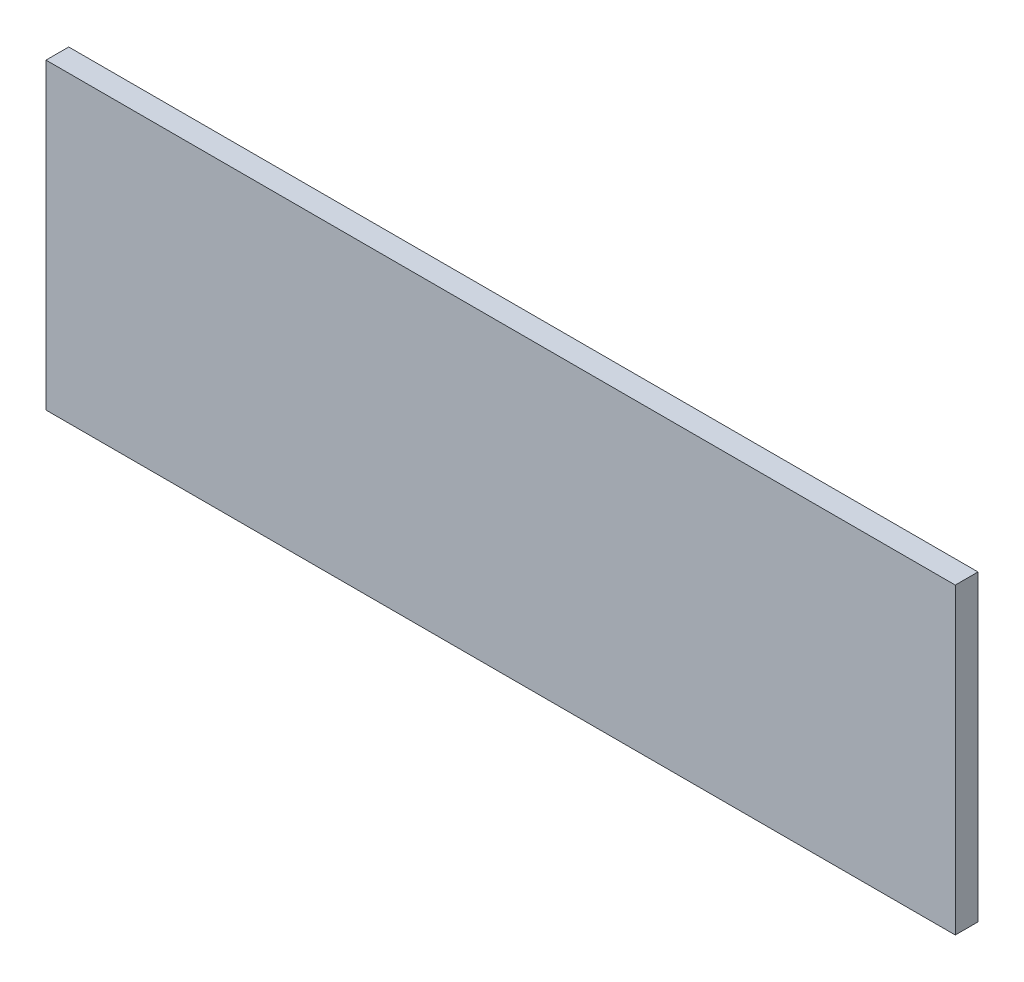
ISO-10303-21;
HEADER;
FILE_DESCRIPTION(('STEP AP214'),'2;1');
FILE_NAME('part.step','',(''),(''),'','','');
FILE_SCHEMA(('AUTOMOTIVE_DESIGN { 1 0 10303 214 1 1 1 1 }'));
ENDSEC;
DATA;
#1=APPLICATION_CONTEXT('core data for automotive mechanical design processes');
#2=APPLICATION_PROTOCOL_DEFINITION('international standard','automotive_design',2000,#1);
#3=PRODUCT_CONTEXT('',#1,'mechanical');
#4=PRODUCT('Part','Part','',(#3));
#5=PRODUCT_RELATED_PRODUCT_CATEGORY('part','',(#4));
#6=PRODUCT_DEFINITION_FORMATION('','',#4);
#7=PRODUCT_DEFINITION_CONTEXT('part definition',#1,'design');
#8=PRODUCT_DEFINITION('design','',#6,#7);
#9=PRODUCT_DEFINITION_SHAPE('','',#8);
#10=(LENGTH_UNIT() NAMED_UNIT(*) SI_UNIT(.MILLI.,.METRE.));
#11=(NAMED_UNIT(*) PLANE_ANGLE_UNIT() SI_UNIT($,.RADIAN.));
#12=(NAMED_UNIT(*) SI_UNIT($,.STERADIAN.) SOLID_ANGLE_UNIT());
#13=UNCERTAINTY_MEASURE_WITH_UNIT(LENGTH_MEASURE(1.E-05),#10,'distance_accuracy_value','');
#14=(GEOMETRIC_REPRESENTATION_CONTEXT(3) GLOBAL_UNCERTAINTY_ASSIGNED_CONTEXT((#13)) GLOBAL_UNIT_ASSIGNED_CONTEXT((#10,
#11,#12)) REPRESENTATION_CONTEXT('',''));
#15=CARTESIAN_POINT('',(0.,0.,0.));
#16=DIRECTION('',(0.,0.,1.));
#17=DIRECTION('',(1.,0.,0.));
#18=AXIS2_PLACEMENT_3D('',#15,#16,#17);
#19=CARTESIAN_POINT('',(6000.,2000.,300.));
#20=DIRECTION('',(-1.,0.,0.));
#21=DIRECTION('',(0.,0.,1.));
#22=AXIS2_PLACEMENT_3D('',#19,#20,#21);
#23=PLANE('',#22);
#24=DIRECTION('',(0.,1.,0.));
#25=VECTOR('',#24,1.);
#26=CARTESIAN_POINT('',(6000.,2000.,0.));
#27=LINE('',#26,#25);
#28=CARTESIAN_POINT('',(6000.,-2000.,0.));
#29=VERTEX_POINT('',#28);
#30=CARTESIAN_POINT('',(6000.,2000.,0.));
#31=VERTEX_POINT('',#30);
#32=EDGE_CURVE('E111',#29,#31,#27,.T.);
#33=ORIENTED_EDGE('',*,*,#32,.T.);
#34=DIRECTION('',(0.,0.,-1.));
#35=VECTOR('',#34,1.);
#36=CARTESIAN_POINT('',(6000.,2000.,300.));
#37=LINE('',#36,#35);
#38=CARTESIAN_POINT('',(6000.,2000.,300.));
#39=VERTEX_POINT('',#38);
#40=EDGE_CURVE('E11',#39,#31,#37,.T.);
#41=ORIENTED_EDGE('',*,*,#40,.F.);
#42=DIRECTION('',(0.,1.,0.));
#43=VECTOR('',#42,1.);
#44=CARTESIAN_POINT('',(6000.,2000.,300.));
#45=LINE('',#44,#43);
#46=CARTESIAN_POINT('',(6000.,-2000.,300.));
#47=VERTEX_POINT('',#46);
#48=EDGE_CURVE('E95',#47,#39,#45,.T.);
#49=ORIENTED_EDGE('',*,*,#48,.F.);
#50=DIRECTION('',(0.,0.,-1.));
#51=VECTOR('',#50,1.);
#52=CARTESIAN_POINT('',(6000.,-2000.,300.));
#53=LINE('',#52,#51);
#54=EDGE_CURVE('E107',#47,#29,#53,.T.);
#55=ORIENTED_EDGE('',*,*,#54,.T.);
#56=EDGE_LOOP('',(#33,#41,#49,#55));
#57=FACE_BOUND('',#56,.T.);
#58=ADVANCED_FACE('F43',(#57),#23,.F.);
#59=CARTESIAN_POINT('',(-6000.,2000.,300.));
#60=DIRECTION('',(0.,-1.,0.));
#61=DIRECTION('',(0.,0.,-1.));
#62=AXIS2_PLACEMENT_3D('',#59,#60,#61);
#63=PLANE('',#62);
#64=DIRECTION('',(-1.,0.,0.));
#65=VECTOR('',#64,1.);
#66=CARTESIAN_POINT('',(-6000.,2000.,0.));
#67=LINE('',#66,#65);
#68=CARTESIAN_POINT('',(-6000.,2000.,0.));
#69=VERTEX_POINT('',#68);
#70=EDGE_CURVE('E100',#31,#69,#67,.T.);
#71=ORIENTED_EDGE('',*,*,#70,.T.);
#72=DIRECTION('',(0.,0.,-1.));
#73=VECTOR('',#72,1.);
#74=CARTESIAN_POINT('',(-6000.,2000.,300.));
#75=LINE('',#74,#73);
#76=CARTESIAN_POINT('',(-6000.,2000.,300.));
#77=VERTEX_POINT('',#76);
#78=EDGE_CURVE('E52',#77,#69,#75,.T.);
#79=ORIENTED_EDGE('',*,*,#78,.F.);
#80=DIRECTION('',(-1.,0.,0.));
#81=VECTOR('',#80,1.);
#82=CARTESIAN_POINT('',(-6000.,2000.,300.));
#83=LINE('',#82,#81);
#84=EDGE_CURVE('E90',#39,#77,#83,.T.);
#85=ORIENTED_EDGE('',*,*,#84,.F.);
#86=ORIENTED_EDGE('',*,*,#40,.T.);
#87=EDGE_LOOP('',(#71,#79,#85,#86));
#88=FACE_BOUND('',#87,.T.);
#89=ADVANCED_FACE('F99',(#88),#63,.F.);
#90=CARTESIAN_POINT('',(-6000.,2000.,300.));
#91=DIRECTION('',(1.,0.,0.));
#92=DIRECTION('',(0.,0.,-1.));
#93=AXIS2_PLACEMENT_3D('',#90,#91,#92);
#94=PLANE('',#93);
#95=DIRECTION('',(0.,-1.,0.));
#96=VECTOR('',#95,1.);
#97=CARTESIAN_POINT('',(-6000.,2000.,0.));
#98=LINE('',#97,#96);
#99=CARTESIAN_POINT('',(-6000.,-2000.,0.));
#100=VERTEX_POINT('',#99);
#101=EDGE_CURVE('E77',#69,#100,#98,.T.);
#102=ORIENTED_EDGE('',*,*,#101,.T.);
#103=DIRECTION('',(0.,0.,-1.));
#104=VECTOR('',#103,1.);
#105=CARTESIAN_POINT('',(-6000.,-2000.,300.));
#106=LINE('',#105,#104);
#107=CARTESIAN_POINT('',(-6000.,-2000.,300.));
#108=VERTEX_POINT('',#107);
#109=EDGE_CURVE('E102',#108,#100,#106,.T.);
#110=ORIENTED_EDGE('',*,*,#109,.F.);
#111=DIRECTION('',(0.,-1.,0.));
#112=VECTOR('',#111,1.);
#113=CARTESIAN_POINT('',(-6000.,2000.,300.));
#114=LINE('',#113,#112);
#115=EDGE_CURVE('E93',#77,#108,#114,.T.);
#116=ORIENTED_EDGE('',*,*,#115,.F.);
#117=ORIENTED_EDGE('',*,*,#78,.T.);
#118=EDGE_LOOP('',(#102,#110,#116,#117));
#119=FACE_BOUND('',#118,.T.);
#120=ADVANCED_FACE('F103',(#119),#94,.F.);
#121=CARTESIAN_POINT('',(-6000.,-2000.,300.));
#122=DIRECTION('',(0.,1.,0.));
#123=DIRECTION('',(0.,0.,1.));
#124=AXIS2_PLACEMENT_3D('',#121,#122,#123);
#125=PLANE('',#124);
#126=DIRECTION('',(1.,0.,0.));
#127=VECTOR('',#126,1.);
#128=CARTESIAN_POINT('',(-6000.,-2000.,0.));
#129=LINE('',#128,#127);
#130=EDGE_CURVE('E83',#100,#29,#129,.T.);
#131=ORIENTED_EDGE('',*,*,#130,.T.);
#132=ORIENTED_EDGE('',*,*,#54,.F.);
#133=DIRECTION('',(1.,0.,0.));
#134=VECTOR('',#133,1.);
#135=CARTESIAN_POINT('',(-6000.,-2000.,300.));
#136=LINE('',#135,#134);
#137=EDGE_CURVE('E60',#108,#47,#136,.T.);
#138=ORIENTED_EDGE('',*,*,#137,.F.);
#139=ORIENTED_EDGE('',*,*,#109,.T.);
#140=EDGE_LOOP('',(#131,#132,#138,#139));
#141=FACE_BOUND('',#140,.T.);
#142=ADVANCED_FACE('F124',(#141),#125,.F.);
#143=CARTESIAN_POINT('',(0.,0.,300.));
#144=DIRECTION('',(0.,0.,1.));
#145=DIRECTION('',(1.,0.,0.));
#146=AXIS2_PLACEMENT_3D('',#143,#144,#145);
#147=PLANE('',#146);
#148=ORIENTED_EDGE('',*,*,#48,.T.);
#149=ORIENTED_EDGE('',*,*,#84,.T.);
#150=ORIENTED_EDGE('',*,*,#115,.T.);
#151=ORIENTED_EDGE('',*,*,#137,.T.);
#152=EDGE_LOOP('',(#148,#149,#150,#151));
#153=FACE_BOUND('',#152,.T.);
#154=ADVANCED_FACE('F91',(#153),#147,.T.);
#155=CARTESIAN_POINT('',(0.,0.,0.));
#156=DIRECTION('',(0.,0.,1.));
#157=DIRECTION('',(1.,0.,0.));
#158=AXIS2_PLACEMENT_3D('',#155,#156,#157);
#159=PLANE('',#158);
#160=ORIENTED_EDGE('',*,*,#32,.F.);
#161=ORIENTED_EDGE('',*,*,#130,.F.);
#162=ORIENTED_EDGE('',*,*,#101,.F.);
#163=ORIENTED_EDGE('',*,*,#70,.F.);
#164=EDGE_LOOP('',(#160,#161,#162,#163));
#165=FACE_BOUND('',#164,.T.);
#166=ADVANCED_FACE('F127',(#165),#159,.F.);
#167=CLOSED_SHELL('',(#58,#89,#120,#142,#154,#166));
#168=MANIFOLD_SOLID_BREP('B2',#167);
#169=ADVANCED_BREP_SHAPE_REPRESENTATION('',(#18,#168),#14);
#170=SHAPE_DEFINITION_REPRESENTATION(#9,#169);
ENDSEC;
END-ISO-10303-21;
